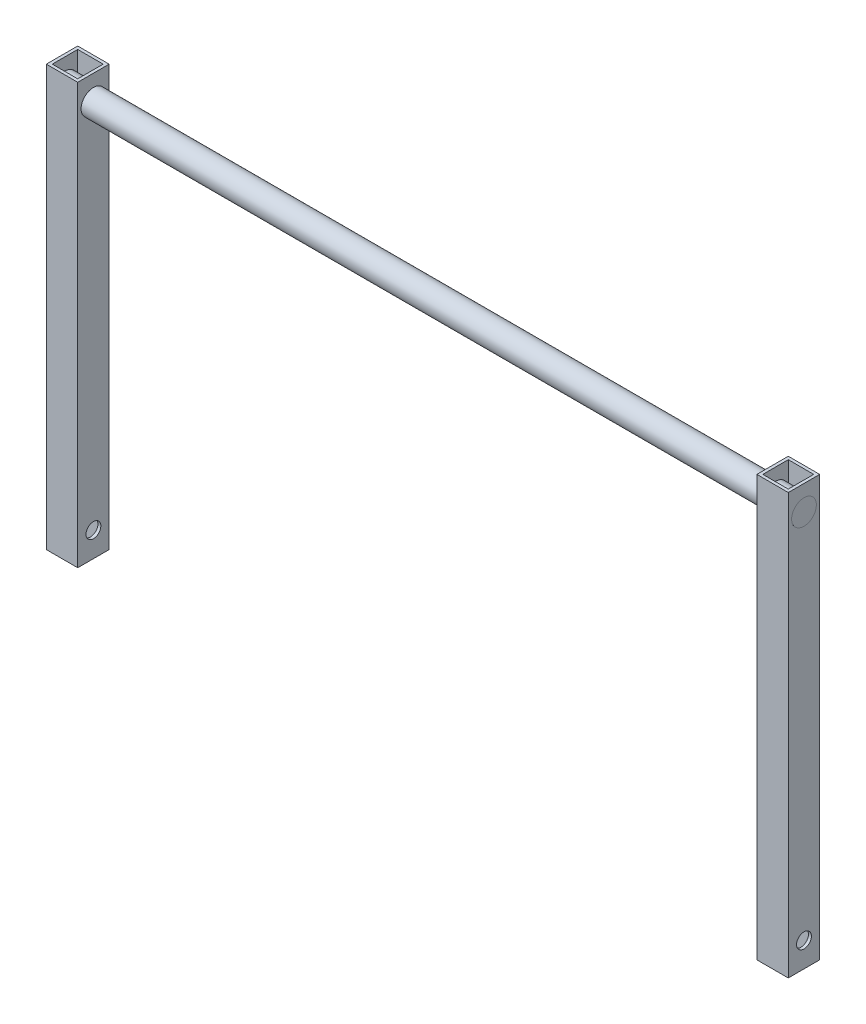
ISO-10303-21;
HEADER;
FILE_DESCRIPTION(('STEP AP214'),'2;1');
FILE_NAME('part.step','',(''),(''),'','','');
FILE_SCHEMA(('AUTOMOTIVE_DESIGN { 1 0 10303 214 1 1 1 1 }'));
ENDSEC;
DATA;
#1=APPLICATION_CONTEXT('core data for automotive mechanical design processes');
#2=APPLICATION_PROTOCOL_DEFINITION('international standard','automotive_design',2000,#1);
#3=PRODUCT_CONTEXT('',#1,'mechanical');
#4=PRODUCT('Part','Part','',(#3));
#5=PRODUCT_RELATED_PRODUCT_CATEGORY('part','',(#4));
#6=PRODUCT_DEFINITION_FORMATION('','',#4);
#7=PRODUCT_DEFINITION_CONTEXT('part definition',#1,'design');
#8=PRODUCT_DEFINITION('design','',#6,#7);
#9=PRODUCT_DEFINITION_SHAPE('','',#8);
#10=(LENGTH_UNIT() NAMED_UNIT(*) SI_UNIT(.MILLI.,.METRE.));
#11=(NAMED_UNIT(*) PLANE_ANGLE_UNIT() SI_UNIT($,.RADIAN.));
#12=(NAMED_UNIT(*) SI_UNIT($,.STERADIAN.) SOLID_ANGLE_UNIT());
#13=UNCERTAINTY_MEASURE_WITH_UNIT(LENGTH_MEASURE(1.E-05),#10,'distance_accuracy_value','');
#14=(GEOMETRIC_REPRESENTATION_CONTEXT(3) GLOBAL_UNCERTAINTY_ASSIGNED_CONTEXT((#13)) GLOBAL_UNIT_ASSIGNED_CONTEXT((#10,
#11,#12)) REPRESENTATION_CONTEXT('',''));
#15=CARTESIAN_POINT('',(0.,0.,0.));
#16=DIRECTION('',(0.,0.,1.));
#17=DIRECTION('',(1.,0.,0.));
#18=AXIS2_PLACEMENT_3D('',#15,#16,#17);
#19=CARTESIAN_POINT('',(137.3,-160.,0.));
#20=DIRECTION('',(0.,-1.,0.));
#21=DIRECTION('',(0.,0.,-1.));
#22=AXIS2_PLACEMENT_3D('',#19,#20,#21);
#23=PLANE('',#22);
#24=DIRECTION('',(0.,0.,1.));
#25=VECTOR('',#24,1.);
#26=CARTESIAN_POINT('',(150.,-160.,0.));
#27=LINE('',#26,#25);
#28=CARTESIAN_POINT('',(150.,-160.,-6.35000000000002));
#29=VERTEX_POINT('',#28);
#30=CARTESIAN_POINT('',(150.,-160.,6.35000000000002));
#31=VERTEX_POINT('',#30);
#32=EDGE_CURVE('E155',#29,#31,#27,.T.);
#33=ORIENTED_EDGE('',*,*,#32,.T.);
#34=DIRECTION('',(1.,0.,0.));
#35=VECTOR('',#34,1.);
#36=CARTESIAN_POINT('',(137.3,-160.,6.35000000000002));
#37=LINE('',#36,#35);
#38=CARTESIAN_POINT('',(137.3,-160.,6.35000000000002));
#39=VERTEX_POINT('',#38);
#40=EDGE_CURVE('E12',#39,#31,#37,.T.);
#41=ORIENTED_EDGE('',*,*,#40,.F.);
#42=DIRECTION('',(0.,0.,1.));
#43=VECTOR('',#42,1.);
#44=CARTESIAN_POINT('',(137.3,-160.,0.));
#45=LINE('',#44,#43);
#46=CARTESIAN_POINT('',(137.3,-160.,-6.35000000000002));
#47=VERTEX_POINT('',#46);
#48=EDGE_CURVE('E160',#47,#39,#45,.T.);
#49=ORIENTED_EDGE('',*,*,#48,.F.);
#50=DIRECTION('',(1.,0.,0.));
#51=VECTOR('',#50,1.);
#52=CARTESIAN_POINT('',(137.3,-160.,-6.35000000000002));
#53=LINE('',#52,#51);
#54=EDGE_CURVE('E56',#47,#29,#53,.T.);
#55=ORIENTED_EDGE('',*,*,#54,.T.);
#56=EDGE_LOOP('',(#33,#41,#49,#55));
#57=FACE_BOUND('',#56,.T.);
#58=DIRECTION('',(1.,0.,0.));
#59=VECTOR('',#58,1.);
#60=CARTESIAN_POINT('',(137.3,-160.,-5.15000000000002));
#61=LINE('',#60,#59);
#62=CARTESIAN_POINT('',(138.5,-160.,-5.15000000000002));
#63=VERTEX_POINT('',#62);
#64=CARTESIAN_POINT('',(148.8,-160.,-5.15000000000002));
#65=VERTEX_POINT('',#64);
#66=EDGE_CURVE('E136',#63,#65,#61,.T.);
#67=ORIENTED_EDGE('',*,*,#66,.F.);
#68=DIRECTION('',(0.,0.,1.));
#69=VECTOR('',#68,1.);
#70=CARTESIAN_POINT('',(138.5,-160.,0.));
#71=LINE('',#70,#69);
#72=CARTESIAN_POINT('',(138.5,-160.,5.15000000000002));
#73=VERTEX_POINT('',#72);
#74=EDGE_CURVE('E134',#63,#73,#71,.T.);
#75=ORIENTED_EDGE('',*,*,#74,.T.);
#76=DIRECTION('',(1.,0.,0.));
#77=VECTOR('',#76,1.);
#78=CARTESIAN_POINT('',(137.3,-160.,5.15000000000002));
#79=LINE('',#78,#77);
#80=CARTESIAN_POINT('',(148.8,-160.,5.15000000000002));
#81=VERTEX_POINT('',#80);
#82=EDGE_CURVE('E116',#73,#81,#79,.T.);
#83=ORIENTED_EDGE('',*,*,#82,.T.);
#84=DIRECTION('',(0.,0.,1.));
#85=VECTOR('',#84,1.);
#86=CARTESIAN_POINT('',(148.8,-160.,0.));
#87=LINE('',#86,#85);
#88=EDGE_CURVE('E127',#65,#81,#87,.T.);
#89=ORIENTED_EDGE('',*,*,#88,.F.);
#90=EDGE_LOOP('',(#67,#75,#83,#89));
#91=FACE_BOUND('',#90,.T.);
#92=ADVANCED_FACE('F47',(#57,#91),#23,.T.);
#93=CARTESIAN_POINT('',(137.3,10.,0.));
#94=DIRECTION('',(0.,-1.,0.));
#95=DIRECTION('',(0.,0.,-1.));
#96=AXIS2_PLACEMENT_3D('',#93,#94,#95);
#97=PLANE('',#96);
#98=DIRECTION('',(0.,0.,1.));
#99=VECTOR('',#98,1.);
#100=CARTESIAN_POINT('',(150.,10.,0.));
#101=LINE('',#100,#99);
#102=CARTESIAN_POINT('',(150.,10.,-6.35));
#103=VERTEX_POINT('',#102);
#104=CARTESIAN_POINT('',(150.,10.,6.35));
#105=VERTEX_POINT('',#104);
#106=EDGE_CURVE('E138',#103,#105,#101,.T.);
#107=ORIENTED_EDGE('',*,*,#106,.F.);
#108=DIRECTION('',(1.,0.,0.));
#109=VECTOR('',#108,1.);
#110=CARTESIAN_POINT('',(137.3,10.,-6.35));
#111=LINE('',#110,#109);
#112=CARTESIAN_POINT('',(137.3,10.,-6.35));
#113=VERTEX_POINT('',#112);
#114=EDGE_CURVE('E172',#113,#103,#111,.T.);
#115=ORIENTED_EDGE('',*,*,#114,.F.);
#116=DIRECTION('',(0.,0.,1.));
#117=VECTOR('',#116,1.);
#118=CARTESIAN_POINT('',(137.3,10.,0.));
#119=LINE('',#118,#117);
#120=CARTESIAN_POINT('',(137.3,10.,6.35));
#121=VERTEX_POINT('',#120);
#122=EDGE_CURVE('E154',#113,#121,#119,.T.);
#123=ORIENTED_EDGE('',*,*,#122,.T.);
#124=DIRECTION('',(1.,0.,0.));
#125=VECTOR('',#124,1.);
#126=CARTESIAN_POINT('',(137.3,10.,6.35));
#127=LINE('',#126,#125);
#128=EDGE_CURVE('E162',#121,#105,#127,.T.);
#129=ORIENTED_EDGE('',*,*,#128,.T.);
#130=EDGE_LOOP('',(#107,#115,#123,#129));
#131=FACE_BOUND('',#130,.T.);
#132=DIRECTION('',(0.,0.,1.));
#133=VECTOR('',#132,1.);
#134=CARTESIAN_POINT('',(148.8,10.,0.));
#135=LINE('',#134,#133);
#136=CARTESIAN_POINT('',(148.8,10.,-5.15));
#137=VERTEX_POINT('',#136);
#138=CARTESIAN_POINT('',(148.8,10.,5.15));
#139=VERTEX_POINT('',#138);
#140=EDGE_CURVE('E123',#137,#139,#135,.T.);
#141=ORIENTED_EDGE('',*,*,#140,.T.);
#142=DIRECTION('',(1.,0.,0.));
#143=VECTOR('',#142,1.);
#144=CARTESIAN_POINT('',(137.3,10.,5.15));
#145=LINE('',#144,#143);
#146=CARTESIAN_POINT('',(138.5,10.,5.15));
#147=VERTEX_POINT('',#146);
#148=EDGE_CURVE('E119',#147,#139,#145,.T.);
#149=ORIENTED_EDGE('',*,*,#148,.F.);
#150=DIRECTION('',(0.,0.,1.));
#151=VECTOR('',#150,1.);
#152=CARTESIAN_POINT('',(138.5,10.,0.));
#153=LINE('',#152,#151);
#154=CARTESIAN_POINT('',(138.5,10.,-5.15));
#155=VERTEX_POINT('',#154);
#156=EDGE_CURVE('E147',#155,#147,#153,.T.);
#157=ORIENTED_EDGE('',*,*,#156,.F.);
#158=DIRECTION('',(1.,0.,0.));
#159=VECTOR('',#158,1.);
#160=CARTESIAN_POINT('',(137.3,10.,-5.15));
#161=LINE('',#160,#159);
#162=EDGE_CURVE('E140',#155,#137,#161,.T.);
#163=ORIENTED_EDGE('',*,*,#162,.T.);
#164=EDGE_LOOP('',(#141,#149,#157,#163));
#165=FACE_BOUND('',#164,.T.);
#166=ADVANCED_FACE('F217',(#131,#165),#97,.F.);
#167=CARTESIAN_POINT('',(137.3,0.,6.35));
#168=DIRECTION('',(0.,0.,-1.));
#169=DIRECTION('',(0.,1.,0.));
#170=AXIS2_PLACEMENT_3D('',#167,#168,#169);
#171=PLANE('',#170);
#172=DIRECTION('',(0.,-1.,0.));
#173=VECTOR('',#172,1.);
#174=CARTESIAN_POINT('',(150.,0.,6.35));
#175=LINE('',#174,#173);
#176=EDGE_CURVE('E135',#105,#31,#175,.T.);
#177=ORIENTED_EDGE('',*,*,#176,.F.);
#178=ORIENTED_EDGE('',*,*,#128,.F.);
#179=DIRECTION('',(0.,-1.,0.));
#180=VECTOR('',#179,1.);
#181=CARTESIAN_POINT('',(137.3,0.,6.35));
#182=LINE('',#181,#180);
#183=EDGE_CURVE('E152',#121,#39,#182,.T.);
#184=ORIENTED_EDGE('',*,*,#183,.T.);
#185=ORIENTED_EDGE('',*,*,#40,.T.);
#186=EDGE_LOOP('',(#177,#178,#184,#185));
#187=FACE_BOUND('',#186,.T.);
#188=ADVANCED_FACE('F49',(#187),#171,.F.);
#189=CARTESIAN_POINT('',(137.3,0.,-6.35));
#190=DIRECTION('',(0.,0.,-1.));
#191=DIRECTION('',(0.,1.,0.));
#192=AXIS2_PLACEMENT_3D('',#189,#190,#191);
#193=PLANE('',#192);
#194=DIRECTION('',(0.,-1.,0.));
#195=VECTOR('',#194,1.);
#196=CARTESIAN_POINT('',(150.,0.,-6.35));
#197=LINE('',#196,#195);
#198=EDGE_CURVE('E166',#103,#29,#197,.T.);
#199=ORIENTED_EDGE('',*,*,#198,.T.);
#200=ORIENTED_EDGE('',*,*,#54,.F.);
#201=DIRECTION('',(0.,-1.,0.));
#202=VECTOR('',#201,1.);
#203=CARTESIAN_POINT('',(137.3,0.,-6.35));
#204=LINE('',#203,#202);
#205=EDGE_CURVE('E158',#113,#47,#204,.T.);
#206=ORIENTED_EDGE('',*,*,#205,.F.);
#207=ORIENTED_EDGE('',*,*,#114,.T.);
#208=EDGE_LOOP('',(#199,#200,#206,#207));
#209=FACE_BOUND('',#208,.T.);
#210=ADVANCED_FACE('F228',(#209),#193,.T.);
#211=CARTESIAN_POINT('',(137.3,0.,0.));
#212=DIRECTION('',(1.,0.,0.));
#213=DIRECTION('',(0.,0.,1.));
#214=AXIS2_PLACEMENT_3D('',#211,#212,#213);
#215=PLANE('',#214);
#216=CARTESIAN_POINT('',(137.3,-150.,0.));
#217=DIRECTION('',(-1.,0.,0.));
#218=DIRECTION('',(0.,0.,1.));
#219=AXIS2_PLACEMENT_3D('',#216,#217,#218);
#220=CIRCLE('',#219,3.);
#221=CARTESIAN_POINT('',(137.3,-150.,3.));
#222=VERTEX_POINT('',#221);
#223=EDGE_CURVE('E124',#222,#222,#220,.T.);
#224=ORIENTED_EDGE('',*,*,#223,.F.);
#225=EDGE_LOOP('',(#224));
#226=FACE_BOUND('',#225,.T.);
#227=CARTESIAN_POINT('',(137.3,0.,0.));
#228=DIRECTION('',(-1.,0.,0.));
#229=DIRECTION('',(0.,0.,1.));
#230=AXIS2_PLACEMENT_3D('',#227,#228,#229);
#231=CIRCLE('',#230,5.);
#232=CARTESIAN_POINT('',(137.3,0.,5.));
#233=VERTEX_POINT('',#232);
#234=EDGE_CURVE('E183',#233,#233,#231,.T.);
#235=ORIENTED_EDGE('',*,*,#234,.F.);
#236=EDGE_LOOP('',(#235));
#237=FACE_BOUND('',#236,.T.);
#238=ORIENTED_EDGE('',*,*,#183,.F.);
#239=ORIENTED_EDGE('',*,*,#122,.F.);
#240=ORIENTED_EDGE('',*,*,#205,.T.);
#241=ORIENTED_EDGE('',*,*,#48,.T.);
#242=EDGE_LOOP('',(#238,#239,#240,#241));
#243=FACE_BOUND('',#242,.T.);
#244=ADVANCED_FACE('F230',(#226,#237,#243),#215,.F.);
#245=CARTESIAN_POINT('',(150.,0.,0.));
#246=DIRECTION('',(1.,0.,0.));
#247=DIRECTION('',(0.,0.,1.));
#248=AXIS2_PLACEMENT_3D('',#245,#246,#247);
#249=PLANE('',#248);
#250=CARTESIAN_POINT('',(150.,-150.,0.));
#251=DIRECTION('',(-1.,0.,0.));
#252=DIRECTION('',(0.,0.,1.));
#253=AXIS2_PLACEMENT_3D('',#250,#251,#252);
#254=CIRCLE('',#253,3.);
#255=CARTESIAN_POINT('',(150.,-150.,3.));
#256=VERTEX_POINT('',#255);
#257=EDGE_CURVE('E179',#256,#256,#254,.T.);
#258=ORIENTED_EDGE('',*,*,#257,.T.);
#259=EDGE_LOOP('',(#258));
#260=FACE_BOUND('',#259,.T.);
#261=CARTESIAN_POINT('',(150.,0.,0.));
#262=DIRECTION('',(-1.,0.,0.));
#263=DIRECTION('',(0.,0.,1.));
#264=AXIS2_PLACEMENT_3D('',#261,#262,#263);
#265=CIRCLE('',#264,5.);
#266=CARTESIAN_POINT('',(150.,0.,5.));
#267=VERTEX_POINT('',#266);
#268=EDGE_CURVE('E186',#267,#267,#265,.T.);
#269=ORIENTED_EDGE('',*,*,#268,.T.);
#270=EDGE_LOOP('',(#269));
#271=FACE_BOUND('',#270,.T.);
#272=ORIENTED_EDGE('',*,*,#176,.T.);
#273=ORIENTED_EDGE('',*,*,#32,.F.);
#274=ORIENTED_EDGE('',*,*,#198,.F.);
#275=ORIENTED_EDGE('',*,*,#106,.T.);
#276=EDGE_LOOP('',(#272,#273,#274,#275));
#277=FACE_BOUND('',#276,.T.);
#278=ADVANCED_FACE('F226',(#260,#271,#277),#249,.T.);
#279=CARTESIAN_POINT('',(137.3,0.,5.15));
#280=DIRECTION('',(0.,0.,-1.));
#281=DIRECTION('',(0.,1.,0.));
#282=AXIS2_PLACEMENT_3D('',#279,#280,#281);
#283=PLANE('',#282);
#284=DIRECTION('',(0.,-1.,0.));
#285=VECTOR('',#284,1.);
#286=CARTESIAN_POINT('',(148.8,0.,5.15));
#287=LINE('',#286,#285);
#288=EDGE_CURVE('E112',#139,#81,#287,.T.);
#289=ORIENTED_EDGE('',*,*,#288,.T.);
#290=ORIENTED_EDGE('',*,*,#82,.F.);
#291=DIRECTION('',(0.,-1.,0.));
#292=VECTOR('',#291,1.);
#293=CARTESIAN_POINT('',(138.5,0.,5.15));
#294=LINE('',#293,#292);
#295=EDGE_CURVE('E64',#147,#73,#294,.T.);
#296=ORIENTED_EDGE('',*,*,#295,.F.);
#297=ORIENTED_EDGE('',*,*,#148,.T.);
#298=EDGE_LOOP('',(#289,#290,#296,#297));
#299=FACE_BOUND('',#298,.T.);
#300=ADVANCED_FACE('F114',(#299),#283,.T.);
#301=CARTESIAN_POINT('',(137.3,0.,-5.15));
#302=DIRECTION('',(0.,0.,-1.));
#303=DIRECTION('',(0.,1.,0.));
#304=AXIS2_PLACEMENT_3D('',#301,#302,#303);
#305=PLANE('',#304);
#306=DIRECTION('',(0.,-1.,0.));
#307=VECTOR('',#306,1.);
#308=CARTESIAN_POINT('',(148.8,0.,-5.15));
#309=LINE('',#308,#307);
#310=EDGE_CURVE('E129',#137,#65,#309,.T.);
#311=ORIENTED_EDGE('',*,*,#310,.F.);
#312=ORIENTED_EDGE('',*,*,#162,.F.);
#313=DIRECTION('',(0.,-1.,0.));
#314=VECTOR('',#313,1.);
#315=CARTESIAN_POINT('',(138.5,0.,-5.15));
#316=LINE('',#315,#314);
#317=EDGE_CURVE('E69',#155,#63,#316,.T.);
#318=ORIENTED_EDGE('',*,*,#317,.T.);
#319=ORIENTED_EDGE('',*,*,#66,.T.);
#320=EDGE_LOOP('',(#311,#312,#318,#319));
#321=FACE_BOUND('',#320,.T.);
#322=ADVANCED_FACE('F201',(#321),#305,.F.);
#323=CARTESIAN_POINT('',(138.5,0.,0.));
#324=DIRECTION('',(1.,0.,0.));
#325=DIRECTION('',(0.,0.,1.));
#326=AXIS2_PLACEMENT_3D('',#323,#324,#325);
#327=PLANE('',#326);
#328=CARTESIAN_POINT('',(138.5,-150.,0.));
#329=DIRECTION('',(-1.,0.,0.));
#330=DIRECTION('',(0.,0.,1.));
#331=AXIS2_PLACEMENT_3D('',#328,#329,#330);
#332=CIRCLE('',#331,3.);
#333=CARTESIAN_POINT('',(138.5,-150.,3.));
#334=VERTEX_POINT('',#333);
#335=EDGE_CURVE('E195',#334,#334,#332,.T.);
#336=ORIENTED_EDGE('',*,*,#335,.T.);
#337=EDGE_LOOP('',(#336));
#338=FACE_BOUND('',#337,.T.);
#339=CARTESIAN_POINT('',(138.5,0.,0.));
#340=DIRECTION('',(-1.,0.,0.));
#341=DIRECTION('',(0.,0.,1.));
#342=AXIS2_PLACEMENT_3D('',#339,#340,#341);
#343=CIRCLE('',#342,5.);
#344=CARTESIAN_POINT('',(138.5,0.,5.));
#345=VERTEX_POINT('',#344);
#346=EDGE_CURVE('E178',#345,#345,#343,.T.);
#347=ORIENTED_EDGE('',*,*,#346,.T.);
#348=EDGE_LOOP('',(#347));
#349=FACE_BOUND('',#348,.T.);
#350=ORIENTED_EDGE('',*,*,#295,.T.);
#351=ORIENTED_EDGE('',*,*,#74,.F.);
#352=ORIENTED_EDGE('',*,*,#317,.F.);
#353=ORIENTED_EDGE('',*,*,#156,.T.);
#354=EDGE_LOOP('',(#350,#351,#352,#353));
#355=FACE_BOUND('',#354,.T.);
#356=ADVANCED_FACE('F203',(#338,#349,#355),#327,.T.);
#357=CARTESIAN_POINT('',(148.8,0.,0.));
#358=DIRECTION('',(1.,0.,0.));
#359=DIRECTION('',(0.,0.,1.));
#360=AXIS2_PLACEMENT_3D('',#357,#358,#359);
#361=PLANE('',#360);
#362=CARTESIAN_POINT('',(148.8,-150.,0.));
#363=DIRECTION('',(-1.,0.,0.));
#364=DIRECTION('',(0.,0.,1.));
#365=AXIS2_PLACEMENT_3D('',#362,#363,#364);
#366=CIRCLE('',#365,3.);
#367=CARTESIAN_POINT('',(148.8,-150.,3.));
#368=VERTEX_POINT('',#367);
#369=EDGE_CURVE('E51',#368,#368,#366,.T.);
#370=ORIENTED_EDGE('',*,*,#369,.F.);
#371=EDGE_LOOP('',(#370));
#372=FACE_BOUND('',#371,.T.);
#373=CARTESIAN_POINT('',(148.8,0.,0.));
#374=DIRECTION('',(-1.,0.,0.));
#375=DIRECTION('',(0.,0.,1.));
#376=AXIS2_PLACEMENT_3D('',#373,#374,#375);
#377=CIRCLE('',#376,5.);
#378=CARTESIAN_POINT('',(148.8,0.,5.));
#379=VERTEX_POINT('',#378);
#380=EDGE_CURVE('E176',#379,#379,#377,.T.);
#381=ORIENTED_EDGE('',*,*,#380,.F.);
#382=EDGE_LOOP('',(#381));
#383=FACE_BOUND('',#382,.T.);
#384=ORIENTED_EDGE('',*,*,#288,.F.);
#385=ORIENTED_EDGE('',*,*,#140,.F.);
#386=ORIENTED_EDGE('',*,*,#310,.T.);
#387=ORIENTED_EDGE('',*,*,#88,.T.);
#388=EDGE_LOOP('',(#384,#385,#386,#387));
#389=FACE_BOUND('',#388,.T.);
#390=ADVANCED_FACE('F128',(#372,#383,#389),#361,.F.);
#391=CARTESIAN_POINT('',(-150.,0.,0.));
#392=DIRECTION('',(1.,0.,0.));
#393=DIRECTION('',(0.,0.,1.));
#394=AXIS2_PLACEMENT_3D('',#391,#392,#393);
#395=CYLINDRICAL_SURFACE('',#394,5.);
#396=ORIENTED_EDGE('',*,*,#268,.F.);
#397=EDGE_LOOP('',(#396));
#398=FACE_BOUND('',#397,.T.);
#399=ORIENTED_EDGE('',*,*,#380,.T.);
#400=EDGE_LOOP('',(#399));
#401=FACE_BOUND('',#400,.T.);
#402=ADVANCED_FACE('F211',(#398,#401),#395,.F.);
#403=CARTESIAN_POINT('',(-150.,-150.,0.));
#404=DIRECTION('',(1.,0.,0.));
#405=DIRECTION('',(0.,0.,1.));
#406=AXIS2_PLACEMENT_3D('',#403,#404,#405);
#407=CYLINDRICAL_SURFACE('',#406,3.);
#408=ORIENTED_EDGE('',*,*,#257,.F.);
#409=EDGE_LOOP('',(#408));
#410=FACE_BOUND('',#409,.T.);
#411=ORIENTED_EDGE('',*,*,#369,.T.);
#412=EDGE_LOOP('',(#411));
#413=FACE_BOUND('',#412,.T.);
#414=ADVANCED_FACE('F258',(#410,#413),#407,.F.);
#415=ORIENTED_EDGE('',*,*,#346,.F.);
#416=EDGE_LOOP('',(#415));
#417=FACE_BOUND('',#416,.T.);
#418=ORIENTED_EDGE('',*,*,#234,.T.);
#419=EDGE_LOOP('',(#418));
#420=FACE_BOUND('',#419,.T.);
#421=ADVANCED_FACE('F260',(#417,#420),#395,.F.);
#422=ORIENTED_EDGE('',*,*,#335,.F.);
#423=EDGE_LOOP('',(#422));
#424=FACE_BOUND('',#423,.T.);
#425=ORIENTED_EDGE('',*,*,#223,.T.);
#426=EDGE_LOOP('',(#425));
#427=FACE_BOUND('',#426,.T.);
#428=ADVANCED_FACE('F266',(#424,#427),#407,.F.);
#429=CLOSED_SHELL('',(#92,#166,#188,#210,#244,#278,#300,#322,#356,#390,#402,#414,#421,#428));
#430=MANIFOLD_SOLID_BREP('B2',#429);
#431=CARTESIAN_POINT('',(-137.3,-160.,0.));
#432=DIRECTION('',(0.,-1.,0.));
#433=DIRECTION('',(0.,0.,-1.));
#434=AXIS2_PLACEMENT_3D('',#431,#432,#433);
#435=PLANE('',#434);
#436=DIRECTION('',(0.,0.,1.));
#437=VECTOR('',#436,1.);
#438=CARTESIAN_POINT('',(-150.,-160.,0.));
#439=LINE('',#438,#437);
#440=CARTESIAN_POINT('',(-150.,-160.,-6.35000000000002));
#441=VERTEX_POINT('',#440);
#442=CARTESIAN_POINT('',(-150.,-160.,6.35000000000002));
#443=VERTEX_POINT('',#442);
#444=EDGE_CURVE('E473',#441,#443,#439,.T.);
#445=ORIENTED_EDGE('',*,*,#444,.F.);
#446=DIRECTION('',(-1.,0.,0.));
#447=VECTOR('',#446,1.);
#448=CARTESIAN_POINT('',(-137.3,-160.,-6.35000000000002));
#449=LINE('',#448,#447);
#450=CARTESIAN_POINT('',(-137.3,-160.,-6.35000000000002));
#451=VERTEX_POINT('',#450);
#452=EDGE_CURVE('E376',#451,#441,#449,.T.);
#453=ORIENTED_EDGE('',*,*,#452,.F.);
#454=DIRECTION('',(0.,0.,1.));
#455=VECTOR('',#454,1.);
#456=CARTESIAN_POINT('',(-137.3,-160.,0.));
#457=LINE('',#456,#455);
#458=CARTESIAN_POINT('',(-137.3,-160.,6.35000000000002));
#459=VERTEX_POINT('',#458);
#460=EDGE_CURVE('E478',#451,#459,#457,.T.);
#461=ORIENTED_EDGE('',*,*,#460,.T.);
#462=DIRECTION('',(-1.,0.,0.));
#463=VECTOR('',#462,1.);
#464=CARTESIAN_POINT('',(-137.3,-160.,6.35000000000002));
#465=LINE('',#464,#463);
#466=EDGE_CURVE('E45',#459,#443,#465,.T.);
#467=ORIENTED_EDGE('',*,*,#466,.T.);
#468=EDGE_LOOP('',(#445,#453,#461,#467));
#469=FACE_BOUND('',#468,.T.);
#470=DIRECTION('',(-1.,0.,0.));
#471=VECTOR('',#470,1.);
#472=CARTESIAN_POINT('',(-137.3,-160.,-5.15000000000002));
#473=LINE('',#472,#471);
#474=CARTESIAN_POINT('',(-138.5,-160.,-5.15000000000002));
#475=VERTEX_POINT('',#474);
#476=CARTESIAN_POINT('',(-148.8,-160.,-5.15000000000002));
#477=VERTEX_POINT('',#476);
#478=EDGE_CURVE('E443',#475,#477,#473,.T.);
#479=ORIENTED_EDGE('',*,*,#478,.T.);
#480=DIRECTION('',(0.,0.,1.));
#481=VECTOR('',#480,1.);
#482=CARTESIAN_POINT('',(-148.8,-160.,0.));
#483=LINE('',#482,#481);
#484=CARTESIAN_POINT('',(-148.8,-160.,5.15000000000002));
#485=VERTEX_POINT('',#484);
#486=EDGE_CURVE('E449',#477,#485,#483,.T.);
#487=ORIENTED_EDGE('',*,*,#486,.T.);
#488=DIRECTION('',(-1.,0.,0.));
#489=VECTOR('',#488,1.);
#490=CARTESIAN_POINT('',(-137.3,-160.,5.15000000000002));
#491=LINE('',#490,#489);
#492=CARTESIAN_POINT('',(-138.5,-160.,5.15000000000002));
#493=VERTEX_POINT('',#492);
#494=EDGE_CURVE('E434',#493,#485,#491,.T.);
#495=ORIENTED_EDGE('',*,*,#494,.F.);
#496=DIRECTION('',(0.,0.,1.));
#497=VECTOR('',#496,1.);
#498=CARTESIAN_POINT('',(-138.5,-160.,0.));
#499=LINE('',#498,#497);
#500=EDGE_CURVE('E384',#475,#493,#499,.T.);
#501=ORIENTED_EDGE('',*,*,#500,.F.);
#502=EDGE_LOOP('',(#479,#487,#495,#501));
#503=FACE_BOUND('',#502,.T.);
#504=ADVANCED_FACE('F367',(#469,#503),#435,.T.);
#505=CARTESIAN_POINT('',(-137.3,10.,0.));
#506=DIRECTION('',(0.,-1.,0.));
#507=DIRECTION('',(0.,0.,-1.));
#508=AXIS2_PLACEMENT_3D('',#505,#506,#507);
#509=PLANE('',#508);
#510=DIRECTION('',(0.,0.,1.));
#511=VECTOR('',#510,1.);
#512=CARTESIAN_POINT('',(-150.,10.,0.));
#513=LINE('',#512,#511);
#514=CARTESIAN_POINT('',(-150.,10.,-6.35));
#515=VERTEX_POINT('',#514);
#516=CARTESIAN_POINT('',(-150.,10.,6.35));
#517=VERTEX_POINT('',#516);
#518=EDGE_CURVE('E484',#515,#517,#513,.T.);
#519=ORIENTED_EDGE('',*,*,#518,.T.);
#520=DIRECTION('',(-1.,0.,0.));
#521=VECTOR('',#520,1.);
#522=CARTESIAN_POINT('',(-137.3,10.,6.35));
#523=LINE('',#522,#521);
#524=CARTESIAN_POINT('',(-137.3,10.,6.35));
#525=VERTEX_POINT('',#524);
#526=EDGE_CURVE('E481',#525,#517,#523,.T.);
#527=ORIENTED_EDGE('',*,*,#526,.F.);
#528=DIRECTION('',(0.,0.,1.));
#529=VECTOR('',#528,1.);
#530=CARTESIAN_POINT('',(-137.3,10.,0.));
#531=LINE('',#530,#529);
#532=CARTESIAN_POINT('',(-137.3,10.,-6.35));
#533=VERTEX_POINT('',#532);
#534=EDGE_CURVE('E472',#533,#525,#531,.T.);
#535=ORIENTED_EDGE('',*,*,#534,.F.);
#536=DIRECTION('',(-1.,0.,0.));
#537=VECTOR('',#536,1.);
#538=CARTESIAN_POINT('',(-137.3,10.,-6.35));
#539=LINE('',#538,#537);
#540=EDGE_CURVE('E492',#533,#515,#539,.T.);
#541=ORIENTED_EDGE('',*,*,#540,.T.);
#542=EDGE_LOOP('',(#519,#527,#535,#541));
#543=FACE_BOUND('',#542,.T.);
#544=DIRECTION('',(0.,0.,1.));
#545=VECTOR('',#544,1.);
#546=CARTESIAN_POINT('',(-148.8,10.,0.));
#547=LINE('',#546,#545);
#548=CARTESIAN_POINT('',(-148.8,10.,-5.15));
#549=VERTEX_POINT('',#548);
#550=CARTESIAN_POINT('',(-148.8,10.,5.15));
#551=VERTEX_POINT('',#550);
#552=EDGE_CURVE('E452',#549,#551,#547,.T.);
#553=ORIENTED_EDGE('',*,*,#552,.F.);
#554=DIRECTION('',(-1.,0.,0.));
#555=VECTOR('',#554,1.);
#556=CARTESIAN_POINT('',(-137.3,10.,-5.15));
#557=LINE('',#556,#555);
#558=CARTESIAN_POINT('',(-138.5,10.,-5.15));
#559=VERTEX_POINT('',#558);
#560=EDGE_CURVE('E462',#559,#549,#557,.T.);
#561=ORIENTED_EDGE('',*,*,#560,.F.);
#562=DIRECTION('',(0.,0.,1.));
#563=VECTOR('',#562,1.);
#564=CARTESIAN_POINT('',(-138.5,10.,0.));
#565=LINE('',#564,#563);
#566=CARTESIAN_POINT('',(-138.5,10.,5.15));
#567=VERTEX_POINT('',#566);
#568=EDGE_CURVE('E457',#559,#567,#565,.T.);
#569=ORIENTED_EDGE('',*,*,#568,.T.);
#570=DIRECTION('',(-1.,0.,0.));
#571=VECTOR('',#570,1.);
#572=CARTESIAN_POINT('',(-137.3,10.,5.15));
#573=LINE('',#572,#571);
#574=EDGE_CURVE('E464',#567,#551,#573,.T.);
#575=ORIENTED_EDGE('',*,*,#574,.T.);
#576=EDGE_LOOP('',(#553,#561,#569,#575));
#577=FACE_BOUND('',#576,.T.);
#578=ADVANCED_FACE('F522',(#543,#577),#509,.F.);
#579=CARTESIAN_POINT('',(-137.3,0.,6.35));
#580=DIRECTION('',(0.,0.,-1.));
#581=DIRECTION('',(0.,1.,0.));
#582=AXIS2_PLACEMENT_3D('',#579,#580,#581);
#583=PLANE('',#582);
#584=DIRECTION('',(0.,-1.,0.));
#585=VECTOR('',#584,1.);
#586=CARTESIAN_POINT('',(-150.,0.,6.35));
#587=LINE('',#586,#585);
#588=EDGE_CURVE('E442',#517,#443,#587,.T.);
#589=ORIENTED_EDGE('',*,*,#588,.T.);
#590=ORIENTED_EDGE('',*,*,#466,.F.);
#591=DIRECTION('',(0.,-1.,0.));
#592=VECTOR('',#591,1.);
#593=CARTESIAN_POINT('',(-137.3,0.,6.35));
#594=LINE('',#593,#592);
#595=EDGE_CURVE('E470',#525,#459,#594,.T.);
#596=ORIENTED_EDGE('',*,*,#595,.F.);
#597=ORIENTED_EDGE('',*,*,#526,.T.);
#598=EDGE_LOOP('',(#589,#590,#596,#597));
#599=FACE_BOUND('',#598,.T.);
#600=ADVANCED_FACE('F369',(#599),#583,.F.);
#601=CARTESIAN_POINT('',(-137.3,0.,-6.35));
#602=DIRECTION('',(0.,0.,-1.));
#603=DIRECTION('',(0.,1.,0.));
#604=AXIS2_PLACEMENT_3D('',#601,#602,#603);
#605=PLANE('',#604);
#606=DIRECTION('',(0.,-1.,0.));
#607=VECTOR('',#606,1.);
#608=CARTESIAN_POINT('',(-150.,0.,-6.35));
#609=LINE('',#608,#607);
#610=EDGE_CURVE('E486',#515,#441,#609,.T.);
#611=ORIENTED_EDGE('',*,*,#610,.F.);
#612=ORIENTED_EDGE('',*,*,#540,.F.);
#613=DIRECTION('',(0.,-1.,0.));
#614=VECTOR('',#613,1.);
#615=CARTESIAN_POINT('',(-137.3,0.,-6.35));
#616=LINE('',#615,#614);
#617=EDGE_CURVE('E475',#533,#451,#616,.T.);
#618=ORIENTED_EDGE('',*,*,#617,.T.);
#619=ORIENTED_EDGE('',*,*,#452,.T.);
#620=EDGE_LOOP('',(#611,#612,#618,#619));
#621=FACE_BOUND('',#620,.T.);
#622=ADVANCED_FACE('F545',(#621),#605,.T.);
#623=CARTESIAN_POINT('',(-137.3,0.,0.));
#624=DIRECTION('',(-1.,0.,0.));
#625=DIRECTION('',(0.,0.,1.));
#626=AXIS2_PLACEMENT_3D('',#623,#624,#625);
#627=PLANE('',#626);
#628=CARTESIAN_POINT('',(-137.3,-150.,0.));
#629=DIRECTION('',(-1.,0.,0.));
#630=DIRECTION('',(0.,0.,1.));
#631=AXIS2_PLACEMENT_3D('',#628,#629,#630);
#632=CIRCLE('',#631,3.);
#633=CARTESIAN_POINT('',(-137.3,-150.,3.));
#634=VERTEX_POINT('',#633);
#635=EDGE_CURVE('E453',#634,#634,#632,.T.);
#636=ORIENTED_EDGE('',*,*,#635,.T.);
#637=EDGE_LOOP('',(#636));
#638=FACE_BOUND('',#637,.T.);
#639=CARTESIAN_POINT('',(-137.3,0.,0.));
#640=DIRECTION('',(-1.,0.,0.));
#641=DIRECTION('',(0.,0.,1.));
#642=AXIS2_PLACEMENT_3D('',#639,#640,#641);
#643=CIRCLE('',#642,5.);
#644=CARTESIAN_POINT('',(-137.3,0.,5.));
#645=VERTEX_POINT('',#644);
#646=EDGE_CURVE('E502',#645,#645,#643,.T.);
#647=ORIENTED_EDGE('',*,*,#646,.T.);
#648=EDGE_LOOP('',(#647));
#649=FACE_BOUND('',#648,.T.);
#650=ORIENTED_EDGE('',*,*,#595,.T.);
#651=ORIENTED_EDGE('',*,*,#460,.F.);
#652=ORIENTED_EDGE('',*,*,#617,.F.);
#653=ORIENTED_EDGE('',*,*,#534,.T.);
#654=EDGE_LOOP('',(#650,#651,#652,#653));
#655=FACE_BOUND('',#654,.T.);
#656=ADVANCED_FACE('F547',(#638,#649,#655),#627,.F.);
#657=CARTESIAN_POINT('',(-150.,0.,0.));
#658=DIRECTION('',(-1.,0.,0.));
#659=DIRECTION('',(0.,0.,1.));
#660=AXIS2_PLACEMENT_3D('',#657,#658,#659);
#661=PLANE('',#660);
#662=CARTESIAN_POINT('',(-150.,-150.,0.));
#663=DIRECTION('',(-1.,0.,0.));
#664=DIRECTION('',(0.,0.,1.));
#665=AXIS2_PLACEMENT_3D('',#662,#663,#664);
#666=CIRCLE('',#665,3.);
#667=CARTESIAN_POINT('',(-150.,-150.,3.));
#668=VERTEX_POINT('',#667);
#669=EDGE_CURVE('E498',#668,#668,#666,.T.);
#670=ORIENTED_EDGE('',*,*,#669,.F.);
#671=EDGE_LOOP('',(#670));
#672=FACE_BOUND('',#671,.T.);
#673=CARTESIAN_POINT('',(-150.,0.,0.));
#674=DIRECTION('',(-1.,0.,0.));
#675=DIRECTION('',(0.,0.,1.));
#676=AXIS2_PLACEMENT_3D('',#673,#674,#675);
#677=CIRCLE('',#676,5.);
#678=CARTESIAN_POINT('',(-150.,0.,5.));
#679=VERTEX_POINT('',#678);
#680=EDGE_CURVE('E505',#679,#679,#677,.T.);
#681=ORIENTED_EDGE('',*,*,#680,.F.);
#682=EDGE_LOOP('',(#681));
#683=FACE_BOUND('',#682,.T.);
#684=ORIENTED_EDGE('',*,*,#588,.F.);
#685=ORIENTED_EDGE('',*,*,#518,.F.);
#686=ORIENTED_EDGE('',*,*,#610,.T.);
#687=ORIENTED_EDGE('',*,*,#444,.T.);
#688=EDGE_LOOP('',(#684,#685,#686,#687));
#689=FACE_BOUND('',#688,.T.);
#690=ADVANCED_FACE('F532',(#672,#683,#689),#661,.T.);
#691=CARTESIAN_POINT('',(-137.3,0.,5.15));
#692=DIRECTION('',(0.,0.,-1.));
#693=DIRECTION('',(0.,1.,0.));
#694=AXIS2_PLACEMENT_3D('',#691,#692,#693);
#695=PLANE('',#694);
#696=DIRECTION('',(0.,-1.,0.));
#697=VECTOR('',#696,1.);
#698=CARTESIAN_POINT('',(-148.8,0.,5.15));
#699=LINE('',#698,#697);
#700=EDGE_CURVE('E437',#551,#485,#699,.T.);
#701=ORIENTED_EDGE('',*,*,#700,.F.);
#702=ORIENTED_EDGE('',*,*,#574,.F.);
#703=DIRECTION('',(0.,-1.,0.));
#704=VECTOR('',#703,1.);
#705=CARTESIAN_POINT('',(-138.5,0.,5.15));
#706=LINE('',#705,#704);
#707=EDGE_CURVE('E439',#567,#493,#706,.T.);
#708=ORIENTED_EDGE('',*,*,#707,.T.);
#709=ORIENTED_EDGE('',*,*,#494,.T.);
#710=EDGE_LOOP('',(#701,#702,#708,#709));
#711=FACE_BOUND('',#710,.T.);
#712=ADVANCED_FACE('F436',(#711),#695,.T.);
#713=CARTESIAN_POINT('',(-137.3,0.,-5.15));
#714=DIRECTION('',(0.,0.,-1.));
#715=DIRECTION('',(0.,1.,0.));
#716=AXIS2_PLACEMENT_3D('',#713,#714,#715);
#717=PLANE('',#716);
#718=DIRECTION('',(0.,-1.,0.));
#719=VECTOR('',#718,1.);
#720=CARTESIAN_POINT('',(-148.8,0.,-5.15));
#721=LINE('',#720,#719);
#722=EDGE_CURVE('E455',#549,#477,#721,.T.);
#723=ORIENTED_EDGE('',*,*,#722,.T.);
#724=ORIENTED_EDGE('',*,*,#478,.F.);
#725=DIRECTION('',(0.,-1.,0.));
#726=VECTOR('',#725,1.);
#727=CARTESIAN_POINT('',(-138.5,0.,-5.15));
#728=LINE('',#727,#726);
#729=EDGE_CURVE('E391',#559,#475,#728,.T.);
#730=ORIENTED_EDGE('',*,*,#729,.F.);
#731=ORIENTED_EDGE('',*,*,#560,.T.);
#732=EDGE_LOOP('',(#723,#724,#730,#731));
#733=FACE_BOUND('',#732,.T.);
#734=ADVANCED_FACE('F523',(#733),#717,.F.);
#735=CARTESIAN_POINT('',(-138.5,0.,0.));
#736=DIRECTION('',(-1.,0.,0.));
#737=DIRECTION('',(0.,0.,1.));
#738=AXIS2_PLACEMENT_3D('',#735,#736,#737);
#739=PLANE('',#738);
#740=CARTESIAN_POINT('',(-138.5,-150.,0.));
#741=DIRECTION('',(-1.,0.,0.));
#742=DIRECTION('',(0.,0.,1.));
#743=AXIS2_PLACEMENT_3D('',#740,#741,#742);
#744=CIRCLE('',#743,3.);
#745=CARTESIAN_POINT('',(-138.5,-150.,3.));
#746=VERTEX_POINT('',#745);
#747=EDGE_CURVE('E514',#746,#746,#744,.T.);
#748=ORIENTED_EDGE('',*,*,#747,.F.);
#749=EDGE_LOOP('',(#748));
#750=FACE_BOUND('',#749,.T.);
#751=CARTESIAN_POINT('',(-138.5,0.,0.));
#752=DIRECTION('',(-1.,0.,0.));
#753=DIRECTION('',(0.,0.,1.));
#754=AXIS2_PLACEMENT_3D('',#751,#752,#753);
#755=CIRCLE('',#754,5.);
#756=CARTESIAN_POINT('',(-138.5,0.,5.));
#757=VERTEX_POINT('',#756);
#758=EDGE_CURVE('E497',#757,#757,#755,.T.);
#759=ORIENTED_EDGE('',*,*,#758,.F.);
#760=EDGE_LOOP('',(#759));
#761=FACE_BOUND('',#760,.T.);
#762=ORIENTED_EDGE('',*,*,#707,.F.);
#763=ORIENTED_EDGE('',*,*,#568,.F.);
#764=ORIENTED_EDGE('',*,*,#729,.T.);
#765=ORIENTED_EDGE('',*,*,#500,.T.);
#766=EDGE_LOOP('',(#762,#763,#764,#765));
#767=FACE_BOUND('',#766,.T.);
#768=ADVANCED_FACE('F519',(#750,#761,#767),#739,.T.);
#769=CARTESIAN_POINT('',(-148.8,0.,0.));
#770=DIRECTION('',(-1.,0.,0.));
#771=DIRECTION('',(0.,0.,1.));
#772=AXIS2_PLACEMENT_3D('',#769,#770,#771);
#773=PLANE('',#772);
#774=CARTESIAN_POINT('',(-148.8,-150.,0.));
#775=DIRECTION('',(-1.,0.,0.));
#776=DIRECTION('',(0.,0.,1.));
#777=AXIS2_PLACEMENT_3D('',#774,#775,#776);
#778=CIRCLE('',#777,3.);
#779=CARTESIAN_POINT('',(-148.8,-150.,3.));
#780=VERTEX_POINT('',#779);
#781=EDGE_CURVE('E371',#780,#780,#778,.T.);
#782=ORIENTED_EDGE('',*,*,#781,.T.);
#783=EDGE_LOOP('',(#782));
#784=FACE_BOUND('',#783,.T.);
#785=CARTESIAN_POINT('',(-148.8,0.,0.));
#786=DIRECTION('',(-1.,0.,0.));
#787=DIRECTION('',(0.,0.,1.));
#788=AXIS2_PLACEMENT_3D('',#785,#786,#787);
#789=CIRCLE('',#788,5.);
#790=CARTESIAN_POINT('',(-148.8,0.,5.));
#791=VERTEX_POINT('',#790);
#792=EDGE_CURVE('E495',#791,#791,#789,.T.);
#793=ORIENTED_EDGE('',*,*,#792,.T.);
#794=EDGE_LOOP('',(#793));
#795=FACE_BOUND('',#794,.T.);
#796=ORIENTED_EDGE('',*,*,#700,.T.);
#797=ORIENTED_EDGE('',*,*,#486,.F.);
#798=ORIENTED_EDGE('',*,*,#722,.F.);
#799=ORIENTED_EDGE('',*,*,#552,.T.);
#800=EDGE_LOOP('',(#796,#797,#798,#799));
#801=FACE_BOUND('',#800,.T.);
#802=ADVANCED_FACE('F447',(#784,#795,#801),#773,.F.);
#803=CARTESIAN_POINT('',(150.,0.,0.));
#804=DIRECTION('',(-1.,0.,0.));
#805=DIRECTION('',(0.,0.,1.));
#806=AXIS2_PLACEMENT_3D('',#803,#804,#805);
#807=CYLINDRICAL_SURFACE('',#806,5.);
#808=ORIENTED_EDGE('',*,*,#680,.T.);
#809=EDGE_LOOP('',(#808));
#810=FACE_BOUND('',#809,.T.);
#811=ORIENTED_EDGE('',*,*,#792,.F.);
#812=EDGE_LOOP('',(#811));
#813=FACE_BOUND('',#812,.T.);
#814=ADVANCED_FACE('F573',(#810,#813),#807,.F.);
#815=CARTESIAN_POINT('',(150.,-150.,0.));
#816=DIRECTION('',(-1.,0.,0.));
#817=DIRECTION('',(0.,0.,1.));
#818=AXIS2_PLACEMENT_3D('',#815,#816,#817);
#819=CYLINDRICAL_SURFACE('',#818,3.);
#820=ORIENTED_EDGE('',*,*,#669,.T.);
#821=EDGE_LOOP('',(#820));
#822=FACE_BOUND('',#821,.T.);
#823=ORIENTED_EDGE('',*,*,#781,.F.);
#824=EDGE_LOOP('',(#823));
#825=FACE_BOUND('',#824,.T.);
#826=ADVANCED_FACE('F576',(#822,#825),#819,.F.);
#827=ORIENTED_EDGE('',*,*,#758,.T.);
#828=EDGE_LOOP('',(#827));
#829=FACE_BOUND('',#828,.T.);
#830=ORIENTED_EDGE('',*,*,#646,.F.);
#831=EDGE_LOOP('',(#830));
#832=FACE_BOUND('',#831,.T.);
#833=ADVANCED_FACE('F578',(#829,#832),#807,.F.);
#834=ORIENTED_EDGE('',*,*,#747,.T.);
#835=EDGE_LOOP('',(#834));
#836=FACE_BOUND('',#835,.T.);
#837=ORIENTED_EDGE('',*,*,#635,.F.);
#838=EDGE_LOOP('',(#837));
#839=FACE_BOUND('',#838,.T.);
#840=ADVANCED_FACE('F584',(#836,#839),#819,.F.);
#841=CLOSED_SHELL('',(#504,#578,#600,#622,#656,#690,#712,#734,#768,#802,#814,#826,#833,#840));
#842=MANIFOLD_SOLID_BREP('B6',#841);
#843=CARTESIAN_POINT('',(150.,0.,0.));
#844=DIRECTION('',(-1.,0.,0.));
#845=DIRECTION('',(0.,0.,1.));
#846=AXIS2_PLACEMENT_3D('',#843,#844,#845);
#847=CYLINDRICAL_SURFACE('',#846,5.);
#848=CARTESIAN_POINT('',(150.,0.,0.));
#849=DIRECTION('',(1.,0.,0.));
#850=DIRECTION('',(0.,0.,-1.));
#851=AXIS2_PLACEMENT_3D('',#848,#849,#850);
#852=CIRCLE('',#851,5.);
#853=CARTESIAN_POINT('',(150.,0.,-5.));
#854=VERTEX_POINT('',#853);
#855=EDGE_CURVE('E366',#854,#854,#852,.T.);
#856=ORIENTED_EDGE('',*,*,#855,.F.);
#857=EDGE_LOOP('',(#856));
#858=FACE_BOUND('',#857,.T.);
#859=CARTESIAN_POINT('',(-150.,0.,0.));
#860=DIRECTION('',(1.,0.,0.));
#861=DIRECTION('',(0.,0.,-1.));
#862=AXIS2_PLACEMENT_3D('',#859,#860,#861);
#863=CIRCLE('',#862,5.);
#864=CARTESIAN_POINT('',(-150.,0.,-5.));
#865=VERTEX_POINT('',#864);
#866=EDGE_CURVE('E687',#865,#865,#863,.T.);
#867=ORIENTED_EDGE('',*,*,#866,.T.);
#868=EDGE_LOOP('',(#867));
#869=FACE_BOUND('',#868,.T.);
#870=ADVANCED_FACE('F684',(#858,#869),#847,.T.);
#871=CARTESIAN_POINT('',(150.,0.,0.));
#872=DIRECTION('',(1.,0.,0.));
#873=DIRECTION('',(0.,0.,-1.));
#874=AXIS2_PLACEMENT_3D('',#871,#872,#873);
#875=PLANE('',#874);
#876=ORIENTED_EDGE('',*,*,#855,.T.);
#877=EDGE_LOOP('',(#876));
#878=FACE_BOUND('',#877,.T.);
#879=ADVANCED_FACE('F699',(#878),#875,.T.);
#880=CARTESIAN_POINT('',(-150.,0.,0.));
#881=DIRECTION('',(1.,0.,0.));
#882=DIRECTION('',(0.,0.,-1.));
#883=AXIS2_PLACEMENT_3D('',#880,#881,#882);
#884=PLANE('',#883);
#885=ORIENTED_EDGE('',*,*,#866,.F.);
#886=EDGE_LOOP('',(#885));
#887=FACE_BOUND('',#886,.T.);
#888=ADVANCED_FACE('F697',(#887),#884,.F.);
#889=CLOSED_SHELL('',(#870,#879,#888));
#890=MANIFOLD_SOLID_BREP('B39',#889);
#891=ADVANCED_BREP_SHAPE_REPRESENTATION('',(#18,#430,#842,#890),#14);
#892=SHAPE_DEFINITION_REPRESENTATION(#9,#891);
ENDSEC;
END-ISO-10303-21;
